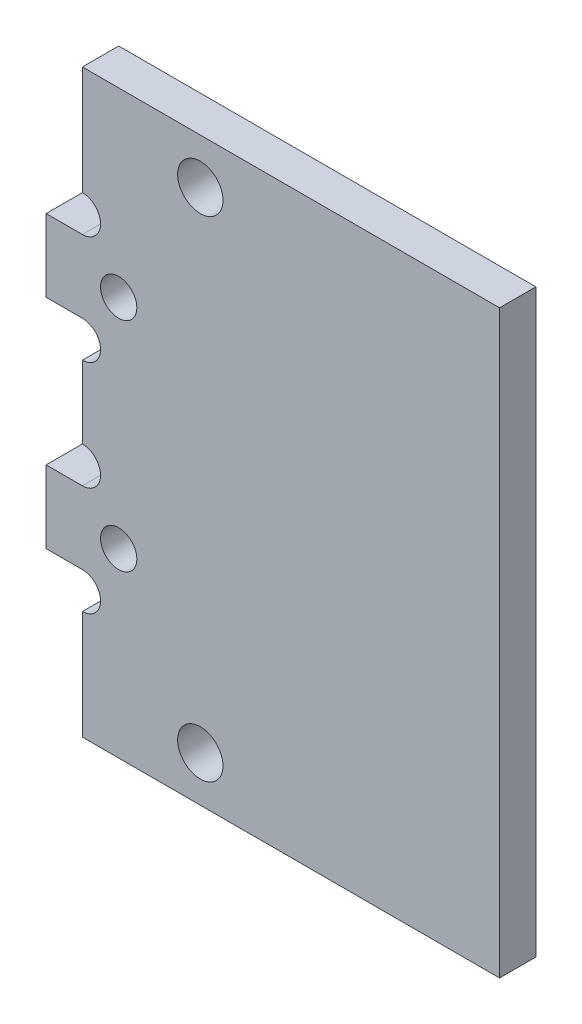
ISO-10303-21;
HEADER;
FILE_DESCRIPTION(('STEP AP214'),'2;1');
FILE_NAME('part.step','',(''),(''),'','','');
FILE_SCHEMA(('AUTOMOTIVE_DESIGN { 1 0 10303 214 1 1 1 1 }'));
ENDSEC;
DATA;
#1=APPLICATION_CONTEXT('core data for automotive mechanical design processes');
#2=APPLICATION_PROTOCOL_DEFINITION('international standard','automotive_design',2000,#1);
#3=PRODUCT_CONTEXT('',#1,'mechanical');
#4=PRODUCT('Part','Part','',(#3));
#5=PRODUCT_RELATED_PRODUCT_CATEGORY('part','',(#4));
#6=PRODUCT_DEFINITION_FORMATION('','',#4);
#7=PRODUCT_DEFINITION_CONTEXT('part definition',#1,'design');
#8=PRODUCT_DEFINITION('design','',#6,#7);
#9=PRODUCT_DEFINITION_SHAPE('','',#8);
#10=(LENGTH_UNIT() NAMED_UNIT(*) SI_UNIT(.MILLI.,.METRE.));
#11=(NAMED_UNIT(*) PLANE_ANGLE_UNIT() SI_UNIT($,.RADIAN.));
#12=(NAMED_UNIT(*) SI_UNIT($,.STERADIAN.) SOLID_ANGLE_UNIT());
#13=UNCERTAINTY_MEASURE_WITH_UNIT(LENGTH_MEASURE(1.E-05),#10,'distance_accuracy_value','');
#14=(GEOMETRIC_REPRESENTATION_CONTEXT(3) GLOBAL_UNCERTAINTY_ASSIGNED_CONTEXT((#13)) GLOBAL_UNIT_ASSIGNED_CONTEXT((#10,
#11,#12)) REPRESENTATION_CONTEXT('',''));
#15=CARTESIAN_POINT('',(0.,0.,0.));
#16=DIRECTION('',(0.,0.,1.));
#17=DIRECTION('',(1.,0.,0.));
#18=AXIS2_PLACEMENT_3D('',#15,#16,#17);
#19=CARTESIAN_POINT('',(-25.7162131979419,3.1625,2.));
#20=DIRECTION('',(0.,0.,1.));
#21=DIRECTION('',(1.,0.,0.));
#22=AXIS2_PLACEMENT_3D('',#19,#20,#21);
#23=PLANE('',#22);
#24=DIRECTION('',(0.,-1.,0.));
#25=VECTOR('',#24,1.);
#26=CARTESIAN_POINT('',(-2.71621319794187,3.1625,2.));
#27=LINE('',#26,#25);
#28=CARTESIAN_POINT('',(-2.71621319794187,10.1625,2.));
#29=VERTEX_POINT('',#28);
#30=CARTESIAN_POINT('',(-2.71621319794187,-21.8375,2.));
#31=VERTEX_POINT('',#30);
#32=EDGE_CURVE('E296',#29,#31,#27,.T.);
#33=ORIENTED_EDGE('',*,*,#32,.F.);
#34=DIRECTION('',(-1.,0.,0.));
#35=VECTOR('',#34,1.);
#36=CARTESIAN_POINT('',(-17.2162131979419,10.1625,2.));
#37=LINE('',#36,#35);
#38=CARTESIAN_POINT('',(-25.7162131979419,10.1625,2.));
#39=VERTEX_POINT('',#38);
#40=EDGE_CURVE('E114',#29,#39,#37,.T.);
#41=ORIENTED_EDGE('',*,*,#40,.T.);
#42=DIRECTION('',(0.,-1.,0.));
#43=VECTOR('',#42,1.);
#44=CARTESIAN_POINT('',(-25.7162131979419,10.1625,2.));
#45=LINE('',#44,#43);
#46=CARTESIAN_POINT('',(-25.7162131979419,4.1625,2.));
#47=VERTEX_POINT('',#46);
#48=EDGE_CURVE('E243',#39,#47,#45,.T.);
#49=ORIENTED_EDGE('',*,*,#48,.T.);
#50=CARTESIAN_POINT('',(-25.7162131979419,3.1625,2.));
#51=DIRECTION('',(0.,0.,-1.));
#52=DIRECTION('',(1.,0.,0.));
#53=AXIS2_PLACEMENT_3D('',#50,#51,#52);
#54=CIRCLE('',#53,1.);
#55=CARTESIAN_POINT('',(-25.7162131979419,2.1625,2.));
#56=VERTEX_POINT('',#55);
#57=EDGE_CURVE('E262',#47,#56,#54,.T.);
#58=ORIENTED_EDGE('',*,*,#57,.T.);
#59=DIRECTION('',(-1.,0.,0.));
#60=VECTOR('',#59,1.);
#61=CARTESIAN_POINT('',(-25.7162131979419,2.1625,2.));
#62=LINE('',#61,#60);
#63=CARTESIAN_POINT('',(-27.7162131979419,2.1625,2.));
#64=VERTEX_POINT('',#63);
#65=EDGE_CURVE('E259',#56,#64,#62,.T.);
#66=ORIENTED_EDGE('',*,*,#65,.T.);
#67=DIRECTION('',(0.,-1.,0.));
#68=VECTOR('',#67,1.);
#69=CARTESIAN_POINT('',(-27.7162131979419,2.1625,2.));
#70=LINE('',#69,#68);
#71=CARTESIAN_POINT('',(-27.7162131979419,-1.8375,2.));
#72=VERTEX_POINT('',#71);
#73=EDGE_CURVE('E261',#64,#72,#70,.T.);
#74=ORIENTED_EDGE('',*,*,#73,.T.);
#75=DIRECTION('',(1.,0.,0.));
#76=VECTOR('',#75,1.);
#77=CARTESIAN_POINT('',(-27.7162131979419,-1.8375,2.));
#78=LINE('',#77,#76);
#79=CARTESIAN_POINT('',(-25.7162131979419,-1.8375,2.));
#80=VERTEX_POINT('',#79);
#81=EDGE_CURVE('E264',#72,#80,#78,.T.);
#82=ORIENTED_EDGE('',*,*,#81,.T.);
#83=CARTESIAN_POINT('',(-25.7162131979419,-2.8375,2.));
#84=DIRECTION('',(0.,0.,-1.));
#85=DIRECTION('',(-1.,0.,0.));
#86=AXIS2_PLACEMENT_3D('',#83,#84,#85);
#87=CIRCLE('',#86,1.);
#88=CARTESIAN_POINT('',(-25.7162131979419,-3.8375,2.));
#89=VERTEX_POINT('',#88);
#90=EDGE_CURVE('E270',#80,#89,#87,.T.);
#91=ORIENTED_EDGE('',*,*,#90,.T.);
#92=DIRECTION('',(0.,-1.,0.));
#93=VECTOR('',#92,1.);
#94=CARTESIAN_POINT('',(-25.7162131979419,-3.8375,2.));
#95=LINE('',#94,#93);
#96=CARTESIAN_POINT('',(-25.7162131979419,-7.8375,2.));
#97=VERTEX_POINT('',#96);
#98=EDGE_CURVE('E272',#89,#97,#95,.T.);
#99=ORIENTED_EDGE('',*,*,#98,.T.);
#100=CARTESIAN_POINT('',(-25.7162131979419,-8.8375,2.));
#101=DIRECTION('',(0.,0.,-1.));
#102=DIRECTION('',(1.,0.,0.));
#103=AXIS2_PLACEMENT_3D('',#100,#101,#102);
#104=CIRCLE('',#103,1.);
#105=CARTESIAN_POINT('',(-25.7162131979419,-9.8375,2.));
#106=VERTEX_POINT('',#105);
#107=EDGE_CURVE('E274',#97,#106,#104,.T.);
#108=ORIENTED_EDGE('',*,*,#107,.T.);
#109=DIRECTION('',(-1.,0.,0.));
#110=VECTOR('',#109,1.);
#111=CARTESIAN_POINT('',(-25.7162131979419,-9.8375,2.));
#112=LINE('',#111,#110);
#113=CARTESIAN_POINT('',(-27.7162131979419,-9.8375,2.));
#114=VERTEX_POINT('',#113);
#115=EDGE_CURVE('E276',#106,#114,#112,.T.);
#116=ORIENTED_EDGE('',*,*,#115,.T.);
#117=DIRECTION('',(0.,-1.,0.));
#118=VECTOR('',#117,1.);
#119=CARTESIAN_POINT('',(-27.7162131979419,-9.8375,2.));
#120=LINE('',#119,#118);
#121=CARTESIAN_POINT('',(-27.7162131979419,-13.8375,2.));
#122=VERTEX_POINT('',#121);
#123=EDGE_CURVE('E155',#114,#122,#120,.T.);
#124=ORIENTED_EDGE('',*,*,#123,.T.);
#125=DIRECTION('',(1.,0.,0.));
#126=VECTOR('',#125,1.);
#127=CARTESIAN_POINT('',(-27.7162131979419,-13.8375,2.));
#128=LINE('',#127,#126);
#129=CARTESIAN_POINT('',(-25.7162131979419,-13.8375,2.));
#130=VERTEX_POINT('',#129);
#131=EDGE_CURVE('E148',#122,#130,#128,.T.);
#132=ORIENTED_EDGE('',*,*,#131,.T.);
#133=CARTESIAN_POINT('',(-25.7162131979419,-14.8375,2.));
#134=DIRECTION('',(0.,0.,-1.));
#135=DIRECTION('',(-1.,0.,0.));
#136=AXIS2_PLACEMENT_3D('',#133,#134,#135);
#137=CIRCLE('',#136,0.999999999999999);
#138=CARTESIAN_POINT('',(-25.7162131979419,-15.8375,2.));
#139=VERTEX_POINT('',#138);
#140=EDGE_CURVE('E152',#130,#139,#137,.T.);
#141=ORIENTED_EDGE('',*,*,#140,.T.);
#142=DIRECTION('',(0.,-1.,0.));
#143=VECTOR('',#142,1.);
#144=CARTESIAN_POINT('',(-25.7162131979419,-15.8375,2.));
#145=LINE('',#144,#143);
#146=CARTESIAN_POINT('',(-25.7162131979419,-21.8375,2.));
#147=VERTEX_POINT('',#146);
#148=EDGE_CURVE('E55',#139,#147,#145,.T.);
#149=ORIENTED_EDGE('',*,*,#148,.T.);
#150=DIRECTION('',(1.,0.,0.));
#151=VECTOR('',#150,1.);
#152=CARTESIAN_POINT('',(-19.7162131979419,-21.8375,2.));
#153=LINE('',#152,#151);
#154=EDGE_CURVE('E173',#147,#31,#153,.T.);
#155=ORIENTED_EDGE('',*,*,#154,.T.);
#156=EDGE_LOOP('',(#33,#41,#49,#58,#66,#74,#82,#91,#99,#108,#116,#124,#132,#141,#149,#155));
#157=FACE_BOUND('',#156,.T.);
#158=CARTESIAN_POINT('',(-23.7162131979419,-11.8375,2.));
#159=DIRECTION('',(0.,0.,1.));
#160=DIRECTION('',(1.,0.,0.));
#161=AXIS2_PLACEMENT_3D('',#158,#159,#160);
#162=CIRCLE('',#161,1.);
#163=CARTESIAN_POINT('',(-22.7162131979419,-11.8375,2.));
#164=VERTEX_POINT('',#163);
#165=EDGE_CURVE('E311',#164,#164,#162,.T.);
#166=ORIENTED_EDGE('',*,*,#165,.F.);
#167=EDGE_LOOP('',(#166));
#168=FACE_BOUND('',#167,.T.);
#169=CARTESIAN_POINT('',(-19.2162131979419,7.66249999999999,2.));
#170=DIRECTION('',(0.,0.,1.));
#171=DIRECTION('',(1.,0.,0.));
#172=AXIS2_PLACEMENT_3D('',#169,#170,#171);
#173=CIRCLE('',#172,1.25);
#174=CARTESIAN_POINT('',(-17.9662131979419,7.66249999999999,2.));
#175=VERTEX_POINT('',#174);
#176=EDGE_CURVE('E182',#175,#175,#173,.T.);
#177=ORIENTED_EDGE('',*,*,#176,.F.);
#178=EDGE_LOOP('',(#177));
#179=FACE_BOUND('',#178,.T.);
#180=CARTESIAN_POINT('',(-19.2162131979419,-19.3375,2.));
#181=DIRECTION('',(0.,0.,1.));
#182=DIRECTION('',(1.,0.,0.));
#183=AXIS2_PLACEMENT_3D('',#180,#181,#182);
#184=CIRCLE('',#183,1.25);
#185=CARTESIAN_POINT('',(-17.9662131979419,-19.3375,2.));
#186=VERTEX_POINT('',#185);
#187=EDGE_CURVE('E317',#186,#186,#184,.T.);
#188=ORIENTED_EDGE('',*,*,#187,.F.);
#189=EDGE_LOOP('',(#188));
#190=FACE_BOUND('',#189,.T.);
#191=CARTESIAN_POINT('',(-23.7162131979419,0.162500000000001,2.));
#192=DIRECTION('',(0.,0.,1.));
#193=DIRECTION('',(1.,0.,0.));
#194=AXIS2_PLACEMENT_3D('',#191,#192,#193);
#195=CIRCLE('',#194,1.);
#196=CARTESIAN_POINT('',(-22.7162131979419,0.162500000000001,2.));
#197=VERTEX_POINT('',#196);
#198=EDGE_CURVE('E305',#197,#197,#195,.T.);
#199=ORIENTED_EDGE('',*,*,#198,.F.);
#200=EDGE_LOOP('',(#199));
#201=FACE_BOUND('',#200,.T.);
#202=ADVANCED_FACE('F32',(#157,#168,#179,#190,#201),#23,.T.);
#203=CARTESIAN_POINT('',(-25.7162131979419,3.1625,0.));
#204=DIRECTION('',(0.,0.,1.));
#205=DIRECTION('',(1.,0.,0.));
#206=AXIS2_PLACEMENT_3D('',#203,#204,#205);
#207=PLANE('',#206);
#208=DIRECTION('',(-1.,0.,0.));
#209=VECTOR('',#208,1.);
#210=CARTESIAN_POINT('',(-17.2162131979419,10.1625,0.));
#211=LINE('',#210,#209);
#212=CARTESIAN_POINT('',(-2.71621319794187,10.1625,0.));
#213=VERTEX_POINT('',#212);
#214=CARTESIAN_POINT('',(-25.7162131979419,10.1625,0.));
#215=VERTEX_POINT('',#214);
#216=EDGE_CURVE('E206',#213,#215,#211,.T.);
#217=ORIENTED_EDGE('',*,*,#216,.F.);
#218=DIRECTION('',(0.,1.,0.));
#219=VECTOR('',#218,1.);
#220=CARTESIAN_POINT('',(-2.71621319794187,10.1625,0.));
#221=LINE('',#220,#219);
#222=CARTESIAN_POINT('',(-2.71621319794187,-21.8375,0.));
#223=VERTEX_POINT('',#222);
#224=EDGE_CURVE('E47',#223,#213,#221,.T.);
#225=ORIENTED_EDGE('',*,*,#224,.F.);
#226=DIRECTION('',(1.,0.,0.));
#227=VECTOR('',#226,1.);
#228=CARTESIAN_POINT('',(13.2837868020581,-21.8375,0.));
#229=LINE('',#228,#227);
#230=CARTESIAN_POINT('',(-25.7162131979419,-21.8375,0.));
#231=VERTEX_POINT('',#230);
#232=EDGE_CURVE('E106',#231,#223,#229,.T.);
#233=ORIENTED_EDGE('',*,*,#232,.F.);
#234=DIRECTION('',(0.,-1.,0.));
#235=VECTOR('',#234,1.);
#236=CARTESIAN_POINT('',(-25.7162131979419,-15.8375,0.));
#237=LINE('',#236,#235);
#238=CARTESIAN_POINT('',(-25.7162131979419,-15.8375,0.));
#239=VERTEX_POINT('',#238);
#240=EDGE_CURVE('E203',#239,#231,#237,.T.);
#241=ORIENTED_EDGE('',*,*,#240,.F.);
#242=CARTESIAN_POINT('',(-25.7162131979419,-14.8375,0.));
#243=DIRECTION('',(0.,0.,-1.));
#244=DIRECTION('',(-1.,0.,0.));
#245=AXIS2_PLACEMENT_3D('',#242,#243,#244);
#246=CIRCLE('',#245,0.999999999999999);
#247=CARTESIAN_POINT('',(-25.7162131979419,-13.8375,0.));
#248=VERTEX_POINT('',#247);
#249=EDGE_CURVE('E201',#248,#239,#246,.T.);
#250=ORIENTED_EDGE('',*,*,#249,.F.);
#251=DIRECTION('',(1.,0.,0.));
#252=VECTOR('',#251,1.);
#253=CARTESIAN_POINT('',(-27.7162131979419,-13.8375,0.));
#254=LINE('',#253,#252);
#255=CARTESIAN_POINT('',(-27.7162131979419,-13.8375,0.));
#256=VERTEX_POINT('',#255);
#257=EDGE_CURVE('E164',#256,#248,#254,.T.);
#258=ORIENTED_EDGE('',*,*,#257,.F.);
#259=DIRECTION('',(0.,-1.,0.));
#260=VECTOR('',#259,1.);
#261=CARTESIAN_POINT('',(-27.7162131979419,-9.8375,0.));
#262=LINE('',#261,#260);
#263=CARTESIAN_POINT('',(-27.7162131979419,-9.8375,0.));
#264=VERTEX_POINT('',#263);
#265=EDGE_CURVE('E198',#264,#256,#262,.T.);
#266=ORIENTED_EDGE('',*,*,#265,.F.);
#267=DIRECTION('',(-1.,0.,0.));
#268=VECTOR('',#267,1.);
#269=CARTESIAN_POINT('',(-25.7162131979419,-9.8375,0.));
#270=LINE('',#269,#268);
#271=CARTESIAN_POINT('',(-25.7162131979419,-9.8375,0.));
#272=VERTEX_POINT('',#271);
#273=EDGE_CURVE('E196',#272,#264,#270,.T.);
#274=ORIENTED_EDGE('',*,*,#273,.F.);
#275=CARTESIAN_POINT('',(-25.7162131979419,-8.8375,0.));
#276=DIRECTION('',(0.,0.,-1.));
#277=DIRECTION('',(1.,0.,0.));
#278=AXIS2_PLACEMENT_3D('',#275,#276,#277);
#279=CIRCLE('',#278,1.);
#280=CARTESIAN_POINT('',(-25.7162131979419,-7.8375,0.));
#281=VERTEX_POINT('',#280);
#282=EDGE_CURVE('E194',#281,#272,#279,.T.);
#283=ORIENTED_EDGE('',*,*,#282,.F.);
#284=DIRECTION('',(0.,-1.,0.));
#285=VECTOR('',#284,1.);
#286=CARTESIAN_POINT('',(-25.7162131979419,-3.8375,0.));
#287=LINE('',#286,#285);
#288=CARTESIAN_POINT('',(-25.7162131979419,-3.8375,0.));
#289=VERTEX_POINT('',#288);
#290=EDGE_CURVE('E192',#289,#281,#287,.T.);
#291=ORIENTED_EDGE('',*,*,#290,.F.);
#292=CARTESIAN_POINT('',(-25.7162131979419,-2.8375,0.));
#293=DIRECTION('',(0.,0.,-1.));
#294=DIRECTION('',(-1.,0.,0.));
#295=AXIS2_PLACEMENT_3D('',#292,#293,#294);
#296=CIRCLE('',#295,1.);
#297=CARTESIAN_POINT('',(-25.7162131979419,-1.8375,0.));
#298=VERTEX_POINT('',#297);
#299=EDGE_CURVE('E190',#298,#289,#296,.T.);
#300=ORIENTED_EDGE('',*,*,#299,.F.);
#301=DIRECTION('',(1.,0.,0.));
#302=VECTOR('',#301,1.);
#303=CARTESIAN_POINT('',(-27.7162131979419,-1.8375,0.));
#304=LINE('',#303,#302);
#305=CARTESIAN_POINT('',(-27.7162131979419,-1.8375,0.));
#306=VERTEX_POINT('',#305);
#307=EDGE_CURVE('E188',#306,#298,#304,.T.);
#308=ORIENTED_EDGE('',*,*,#307,.F.);
#309=DIRECTION('',(0.,-1.,0.));
#310=VECTOR('',#309,1.);
#311=CARTESIAN_POINT('',(-27.7162131979419,2.1625,0.));
#312=LINE('',#311,#310);
#313=CARTESIAN_POINT('',(-27.7162131979419,2.1625,0.));
#314=VERTEX_POINT('',#313);
#315=EDGE_CURVE('E186',#314,#306,#312,.T.);
#316=ORIENTED_EDGE('',*,*,#315,.F.);
#317=DIRECTION('',(-1.,0.,0.));
#318=VECTOR('',#317,1.);
#319=CARTESIAN_POINT('',(-25.7162131979419,2.1625,0.));
#320=LINE('',#319,#318);
#321=CARTESIAN_POINT('',(-25.7162131979419,2.1625,0.));
#322=VERTEX_POINT('',#321);
#323=EDGE_CURVE('E184',#322,#314,#320,.T.);
#324=ORIENTED_EDGE('',*,*,#323,.F.);
#325=CARTESIAN_POINT('',(-25.7162131979419,3.1625,0.));
#326=DIRECTION('',(0.,0.,-1.));
#327=DIRECTION('',(1.,0.,0.));
#328=AXIS2_PLACEMENT_3D('',#325,#326,#327);
#329=CIRCLE('',#328,1.);
#330=CARTESIAN_POINT('',(-25.7162131979419,4.1625,0.));
#331=VERTEX_POINT('',#330);
#332=EDGE_CURVE('E181',#331,#322,#329,.T.);
#333=ORIENTED_EDGE('',*,*,#332,.F.);
#334=DIRECTION('',(0.,-1.,0.));
#335=VECTOR('',#334,1.);
#336=CARTESIAN_POINT('',(-25.7162131979419,10.1625,0.));
#337=LINE('',#336,#335);
#338=EDGE_CURVE('E179',#215,#331,#337,.T.);
#339=ORIENTED_EDGE('',*,*,#338,.F.);
#340=EDGE_LOOP('',(#217,#225,#233,#241,#250,#258,#266,#274,#283,#291,#300,#308,#316,#324,#333,#339));
#341=FACE_BOUND('',#340,.T.);
#342=CARTESIAN_POINT('',(-19.2162131979419,7.66249999999999,0.));
#343=DIRECTION('',(0.,0.,1.));
#344=DIRECTION('',(1.,0.,0.));
#345=AXIS2_PLACEMENT_3D('',#342,#343,#344);
#346=CIRCLE('',#345,1.25);
#347=CARTESIAN_POINT('',(-17.9662131979419,7.66249999999999,0.));
#348=VERTEX_POINT('',#347);
#349=EDGE_CURVE('E320',#348,#348,#346,.T.);
#350=ORIENTED_EDGE('',*,*,#349,.T.);
#351=EDGE_LOOP('',(#350));
#352=FACE_BOUND('',#351,.T.);
#353=CARTESIAN_POINT('',(-19.2162131979419,-19.3375,0.));
#354=DIRECTION('',(0.,0.,1.));
#355=DIRECTION('',(1.,0.,0.));
#356=AXIS2_PLACEMENT_3D('',#353,#354,#355);
#357=CIRCLE('',#356,1.25);
#358=CARTESIAN_POINT('',(-17.9662131979419,-19.3375,0.));
#359=VERTEX_POINT('',#358);
#360=EDGE_CURVE('E314',#359,#359,#357,.T.);
#361=ORIENTED_EDGE('',*,*,#360,.T.);
#362=EDGE_LOOP('',(#361));
#363=FACE_BOUND('',#362,.T.);
#364=CARTESIAN_POINT('',(-23.7162131979419,-11.8375,0.));
#365=DIRECTION('',(0.,0.,1.));
#366=DIRECTION('',(1.,0.,0.));
#367=AXIS2_PLACEMENT_3D('',#364,#365,#366);
#368=CIRCLE('',#367,1.);
#369=CARTESIAN_POINT('',(-22.7162131979419,-11.8375,0.));
#370=VERTEX_POINT('',#369);
#371=EDGE_CURVE('E308',#370,#370,#368,.T.);
#372=ORIENTED_EDGE('',*,*,#371,.T.);
#373=EDGE_LOOP('',(#372));
#374=FACE_BOUND('',#373,.T.);
#375=CARTESIAN_POINT('',(-23.7162131979419,0.162500000000001,0.));
#376=DIRECTION('',(0.,0.,1.));
#377=DIRECTION('',(1.,0.,0.));
#378=AXIS2_PLACEMENT_3D('',#375,#376,#377);
#379=CIRCLE('',#378,1.);
#380=CARTESIAN_POINT('',(-22.7162131979419,0.162500000000001,0.));
#381=VERTEX_POINT('',#380);
#382=EDGE_CURVE('E304',#381,#381,#379,.T.);
#383=ORIENTED_EDGE('',*,*,#382,.T.);
#384=EDGE_LOOP('',(#383));
#385=FACE_BOUND('',#384,.T.);
#386=ADVANCED_FACE('F247',(#341,#352,#363,#374,#385),#207,.F.);
#387=CARTESIAN_POINT('',(-25.7162131979419,10.1625,2.));
#388=DIRECTION('',(1.,0.,0.));
#389=DIRECTION('',(0.,1.,0.));
#390=AXIS2_PLACEMENT_3D('',#387,#388,#389);
#391=PLANE('',#390);
#392=ORIENTED_EDGE('',*,*,#338,.T.);
#393=DIRECTION('',(0.,0.,-1.));
#394=VECTOR('',#393,1.);
#395=CARTESIAN_POINT('',(-25.7162131979419,4.1625,2.));
#396=LINE('',#395,#394);
#397=EDGE_CURVE('E236',#47,#331,#396,.T.);
#398=ORIENTED_EDGE('',*,*,#397,.F.);
#399=ORIENTED_EDGE('',*,*,#48,.F.);
#400=DIRECTION('',(0.,0.,-1.));
#401=VECTOR('',#400,1.);
#402=CARTESIAN_POINT('',(-25.7162131979419,10.1625,2.));
#403=LINE('',#402,#401);
#404=EDGE_CURVE('E40',#39,#215,#403,.T.);
#405=ORIENTED_EDGE('',*,*,#404,.T.);
#406=EDGE_LOOP('',(#392,#398,#399,#405));
#407=FACE_BOUND('',#406,.T.);
#408=ADVANCED_FACE('F34',(#407),#391,.F.);
#409=CARTESIAN_POINT('',(-25.7162131979419,3.1625,2.));
#410=DIRECTION('',(0.,0.,-1.));
#411=DIRECTION('',(-1.,0.,0.));
#412=AXIS2_PLACEMENT_3D('',#409,#410,#411);
#413=CYLINDRICAL_SURFACE('',#412,1.);
#414=ORIENTED_EDGE('',*,*,#332,.T.);
#415=DIRECTION('',(0.,0.,-1.));
#416=VECTOR('',#415,1.);
#417=CARTESIAN_POINT('',(-25.7162131979419,2.1625,2.));
#418=LINE('',#417,#416);
#419=EDGE_CURVE('E233',#56,#322,#418,.T.);
#420=ORIENTED_EDGE('',*,*,#419,.F.);
#421=ORIENTED_EDGE('',*,*,#57,.F.);
#422=ORIENTED_EDGE('',*,*,#397,.T.);
#423=EDGE_LOOP('',(#414,#420,#421,#422));
#424=FACE_BOUND('',#423,.T.);
#425=ADVANCED_FACE('F253',(#424),#413,.F.);
#426=CARTESIAN_POINT('',(-25.7162131979419,2.1625,2.));
#427=DIRECTION('',(0.,-1.,0.));
#428=DIRECTION('',(1.,0.,0.));
#429=AXIS2_PLACEMENT_3D('',#426,#427,#428);
#430=PLANE('',#429);
#431=ORIENTED_EDGE('',*,*,#323,.T.);
#432=DIRECTION('',(0.,0.,-1.));
#433=VECTOR('',#432,1.);
#434=CARTESIAN_POINT('',(-27.7162131979419,2.1625,2.));
#435=LINE('',#434,#433);
#436=EDGE_CURVE('E230',#64,#314,#435,.T.);
#437=ORIENTED_EDGE('',*,*,#436,.F.);
#438=ORIENTED_EDGE('',*,*,#65,.F.);
#439=ORIENTED_EDGE('',*,*,#419,.T.);
#440=EDGE_LOOP('',(#431,#437,#438,#439));
#441=FACE_BOUND('',#440,.T.);
#442=ADVANCED_FACE('F257',(#441),#430,.F.);
#443=CARTESIAN_POINT('',(-27.7162131979419,2.1625,2.));
#444=DIRECTION('',(1.,0.,0.));
#445=DIRECTION('',(0.,0.,-1.));
#446=AXIS2_PLACEMENT_3D('',#443,#444,#445);
#447=PLANE('',#446);
#448=ORIENTED_EDGE('',*,*,#315,.T.);
#449=DIRECTION('',(0.,0.,-1.));
#450=VECTOR('',#449,1.);
#451=CARTESIAN_POINT('',(-27.7162131979419,-1.8375,2.));
#452=LINE('',#451,#450);
#453=EDGE_CURVE('E227',#72,#306,#452,.T.);
#454=ORIENTED_EDGE('',*,*,#453,.F.);
#455=ORIENTED_EDGE('',*,*,#73,.F.);
#456=ORIENTED_EDGE('',*,*,#436,.T.);
#457=EDGE_LOOP('',(#448,#454,#455,#456));
#458=FACE_BOUND('',#457,.T.);
#459=ADVANCED_FACE('F378',(#458),#447,.F.);
#460=CARTESIAN_POINT('',(-27.7162131979419,-1.8375,2.));
#461=DIRECTION('',(0.,1.,0.));
#462=DIRECTION('',(0.,0.,1.));
#463=AXIS2_PLACEMENT_3D('',#460,#461,#462);
#464=PLANE('',#463);
#465=ORIENTED_EDGE('',*,*,#307,.T.);
#466=DIRECTION('',(0.,0.,-1.));
#467=VECTOR('',#466,1.);
#468=CARTESIAN_POINT('',(-25.7162131979419,-1.8375,2.));
#469=LINE('',#468,#467);
#470=EDGE_CURVE('E224',#80,#298,#469,.T.);
#471=ORIENTED_EDGE('',*,*,#470,.F.);
#472=ORIENTED_EDGE('',*,*,#81,.F.);
#473=ORIENTED_EDGE('',*,*,#453,.T.);
#474=EDGE_LOOP('',(#465,#471,#472,#473));
#475=FACE_BOUND('',#474,.T.);
#476=ADVANCED_FACE('F374',(#475),#464,.F.);
#477=CARTESIAN_POINT('',(-25.7162131979419,-2.8375,2.));
#478=DIRECTION('',(0.,0.,-1.));
#479=DIRECTION('',(-1.,0.,0.));
#480=AXIS2_PLACEMENT_3D('',#477,#478,#479);
#481=CYLINDRICAL_SURFACE('',#480,1.);
#482=ORIENTED_EDGE('',*,*,#299,.T.);
#483=DIRECTION('',(0.,0.,-1.));
#484=VECTOR('',#483,1.);
#485=CARTESIAN_POINT('',(-25.7162131979419,-3.8375,2.));
#486=LINE('',#485,#484);
#487=EDGE_CURVE('E221',#89,#289,#486,.T.);
#488=ORIENTED_EDGE('',*,*,#487,.F.);
#489=ORIENTED_EDGE('',*,*,#90,.F.);
#490=ORIENTED_EDGE('',*,*,#470,.T.);
#491=EDGE_LOOP('',(#482,#488,#489,#490));
#492=FACE_BOUND('',#491,.T.);
#493=ADVANCED_FACE('F370',(#492),#481,.F.);
#494=CARTESIAN_POINT('',(-25.7162131979419,-3.8375,2.));
#495=DIRECTION('',(1.,0.,0.));
#496=DIRECTION('',(0.,0.,-1.));
#497=AXIS2_PLACEMENT_3D('',#494,#495,#496);
#498=PLANE('',#497);
#499=ORIENTED_EDGE('',*,*,#290,.T.);
#500=DIRECTION('',(0.,0.,-1.));
#501=VECTOR('',#500,1.);
#502=CARTESIAN_POINT('',(-25.7162131979419,-7.8375,2.));
#503=LINE('',#502,#501);
#504=EDGE_CURVE('E218',#97,#281,#503,.T.);
#505=ORIENTED_EDGE('',*,*,#504,.F.);
#506=ORIENTED_EDGE('',*,*,#98,.F.);
#507=ORIENTED_EDGE('',*,*,#487,.T.);
#508=EDGE_LOOP('',(#499,#505,#506,#507));
#509=FACE_BOUND('',#508,.T.);
#510=ADVANCED_FACE('F366',(#509),#498,.F.);
#511=CARTESIAN_POINT('',(-25.7162131979419,-8.8375,2.));
#512=DIRECTION('',(0.,0.,-1.));
#513=DIRECTION('',(-1.,0.,0.));
#514=AXIS2_PLACEMENT_3D('',#511,#512,#513);
#515=CYLINDRICAL_SURFACE('',#514,1.);
#516=ORIENTED_EDGE('',*,*,#282,.T.);
#517=DIRECTION('',(0.,0.,-1.));
#518=VECTOR('',#517,1.);
#519=CARTESIAN_POINT('',(-25.7162131979419,-9.8375,2.));
#520=LINE('',#519,#518);
#521=EDGE_CURVE('E215',#106,#272,#520,.T.);
#522=ORIENTED_EDGE('',*,*,#521,.F.);
#523=ORIENTED_EDGE('',*,*,#107,.F.);
#524=ORIENTED_EDGE('',*,*,#504,.T.);
#525=EDGE_LOOP('',(#516,#522,#523,#524));
#526=FACE_BOUND('',#525,.T.);
#527=ADVANCED_FACE('F363',(#526),#515,.F.);
#528=CARTESIAN_POINT('',(-25.7162131979419,-9.8375,2.));
#529=DIRECTION('',(0.,-1.,0.));
#530=DIRECTION('',(0.,0.,-1.));
#531=AXIS2_PLACEMENT_3D('',#528,#529,#530);
#532=PLANE('',#531);
#533=ORIENTED_EDGE('',*,*,#273,.T.);
#534=DIRECTION('',(0.,0.,-1.));
#535=VECTOR('',#534,1.);
#536=CARTESIAN_POINT('',(-27.7162131979419,-9.8375,2.));
#537=LINE('',#536,#535);
#538=EDGE_CURVE('E212',#114,#264,#537,.T.);
#539=ORIENTED_EDGE('',*,*,#538,.F.);
#540=ORIENTED_EDGE('',*,*,#115,.F.);
#541=ORIENTED_EDGE('',*,*,#521,.T.);
#542=EDGE_LOOP('',(#533,#539,#540,#541));
#543=FACE_BOUND('',#542,.T.);
#544=ADVANCED_FACE('F282',(#543),#532,.F.);
#545=CARTESIAN_POINT('',(-27.7162131979419,-9.8375,2.));
#546=DIRECTION('',(1.,0.,0.));
#547=DIRECTION('',(0.,0.,-1.));
#548=AXIS2_PLACEMENT_3D('',#545,#546,#547);
#549=PLANE('',#548);
#550=ORIENTED_EDGE('',*,*,#265,.T.);
#551=DIRECTION('',(0.,0.,-1.));
#552=VECTOR('',#551,1.);
#553=CARTESIAN_POINT('',(-27.7162131979419,-13.8375,2.));
#554=LINE('',#553,#552);
#555=EDGE_CURVE('E167',#122,#256,#554,.T.);
#556=ORIENTED_EDGE('',*,*,#555,.F.);
#557=ORIENTED_EDGE('',*,*,#123,.F.);
#558=ORIENTED_EDGE('',*,*,#538,.T.);
#559=EDGE_LOOP('',(#550,#556,#557,#558));
#560=FACE_BOUND('',#559,.T.);
#561=ADVANCED_FACE('F286',(#560),#549,.F.);
#562=CARTESIAN_POINT('',(-27.7162131979419,-13.8375,2.));
#563=DIRECTION('',(0.,1.,0.));
#564=DIRECTION('',(0.,0.,1.));
#565=AXIS2_PLACEMENT_3D('',#562,#563,#564);
#566=PLANE('',#565);
#567=ORIENTED_EDGE('',*,*,#257,.T.);
#568=DIRECTION('',(0.,0.,-1.));
#569=VECTOR('',#568,1.);
#570=CARTESIAN_POINT('',(-25.7162131979419,-13.8375,2.));
#571=LINE('',#570,#569);
#572=EDGE_CURVE('E161',#130,#248,#571,.T.);
#573=ORIENTED_EDGE('',*,*,#572,.F.);
#574=ORIENTED_EDGE('',*,*,#131,.F.);
#575=ORIENTED_EDGE('',*,*,#555,.T.);
#576=EDGE_LOOP('',(#567,#573,#574,#575));
#577=FACE_BOUND('',#576,.T.);
#578=ADVANCED_FACE('F162',(#577),#566,.F.);
#579=CARTESIAN_POINT('',(-25.7162131979419,-14.8375,2.));
#580=DIRECTION('',(0.,0.,-1.));
#581=DIRECTION('',(-1.,0.,0.));
#582=AXIS2_PLACEMENT_3D('',#579,#580,#581);
#583=CYLINDRICAL_SURFACE('',#582,0.999999999999999);
#584=ORIENTED_EDGE('',*,*,#249,.T.);
#585=DIRECTION('',(0.,0.,-1.));
#586=VECTOR('',#585,1.);
#587=CARTESIAN_POINT('',(-25.7162131979419,-15.8375,2.));
#588=LINE('',#587,#586);
#589=EDGE_CURVE('E168',#139,#239,#588,.T.);
#590=ORIENTED_EDGE('',*,*,#589,.F.);
#591=ORIENTED_EDGE('',*,*,#140,.F.);
#592=ORIENTED_EDGE('',*,*,#572,.T.);
#593=EDGE_LOOP('',(#584,#590,#591,#592));
#594=FACE_BOUND('',#593,.T.);
#595=ADVANCED_FACE('F170',(#594),#583,.F.);
#596=CARTESIAN_POINT('',(-25.7162131979419,-15.8375,2.));
#597=DIRECTION('',(1.,0.,0.));
#598=DIRECTION('',(0.,0.,-1.));
#599=AXIS2_PLACEMENT_3D('',#596,#597,#598);
#600=PLANE('',#599);
#601=ORIENTED_EDGE('',*,*,#240,.T.);
#602=DIRECTION('',(0.,0.,-1.));
#603=VECTOR('',#602,1.);
#604=CARTESIAN_POINT('',(-25.7162131979419,-21.8375,2.));
#605=LINE('',#604,#603);
#606=EDGE_CURVE('E178',#147,#231,#605,.T.);
#607=ORIENTED_EDGE('',*,*,#606,.F.);
#608=ORIENTED_EDGE('',*,*,#148,.F.);
#609=ORIENTED_EDGE('',*,*,#589,.T.);
#610=EDGE_LOOP('',(#601,#607,#608,#609));
#611=FACE_BOUND('',#610,.T.);
#612=ADVANCED_FACE('F288',(#611),#600,.F.);
#613=CARTESIAN_POINT('',(13.2837868020581,-21.8375,2.));
#614=DIRECTION('',(0.,1.,0.));
#615=DIRECTION('',(-1.,0.,0.));
#616=AXIS2_PLACEMENT_3D('',#613,#614,#615);
#617=PLANE('',#616);
#618=ORIENTED_EDGE('',*,*,#232,.T.);
#619=DIRECTION('',(0.,0.,-1.));
#620=VECTOR('',#619,1.);
#621=CARTESIAN_POINT('',(-2.71621319794187,-21.8375,10.));
#622=LINE('',#621,#620);
#623=EDGE_CURVE('E294',#31,#223,#622,.T.);
#624=ORIENTED_EDGE('',*,*,#623,.F.);
#625=ORIENTED_EDGE('',*,*,#154,.F.);
#626=ORIENTED_EDGE('',*,*,#606,.T.);
#627=EDGE_LOOP('',(#618,#624,#625,#626));
#628=FACE_BOUND('',#627,.T.);
#629=ADVANCED_FACE('F292',(#628),#617,.F.);
#630=CARTESIAN_POINT('',(-17.2162131979419,10.1625,2.));
#631=DIRECTION('',(0.,-1.,0.));
#632=DIRECTION('',(0.,0.,-1.));
#633=AXIS2_PLACEMENT_3D('',#630,#631,#632);
#634=PLANE('',#633);
#635=ORIENTED_EDGE('',*,*,#40,.F.);
#636=DIRECTION('',(0.,0.,-1.));
#637=VECTOR('',#636,1.);
#638=CARTESIAN_POINT('',(-2.71621319794187,10.1625,2.));
#639=LINE('',#638,#637);
#640=EDGE_CURVE('E11',#29,#213,#639,.T.);
#641=ORIENTED_EDGE('',*,*,#640,.T.);
#642=ORIENTED_EDGE('',*,*,#216,.T.);
#643=ORIENTED_EDGE('',*,*,#404,.F.);
#644=EDGE_LOOP('',(#635,#641,#642,#643));
#645=FACE_BOUND('',#644,.T.);
#646=ADVANCED_FACE('F333',(#645),#634,.F.);
#647=CARTESIAN_POINT('',(-19.2162131979419,7.66249999999999,2.));
#648=DIRECTION('',(0.,0.,-1.));
#649=DIRECTION('',(-1.,0.,0.));
#650=AXIS2_PLACEMENT_3D('',#647,#648,#649);
#651=CYLINDRICAL_SURFACE('',#650,1.25);
#652=ORIENTED_EDGE('',*,*,#176,.T.);
#653=EDGE_LOOP('',(#652));
#654=FACE_BOUND('',#653,.T.);
#655=ORIENTED_EDGE('',*,*,#349,.F.);
#656=EDGE_LOOP('',(#655));
#657=FACE_BOUND('',#656,.T.);
#658=ADVANCED_FACE('F330',(#654,#657),#651,.F.);
#659=CARTESIAN_POINT('',(-19.2162131979419,-19.3375,2.));
#660=DIRECTION('',(0.,0.,-1.));
#661=DIRECTION('',(-1.,0.,0.));
#662=AXIS2_PLACEMENT_3D('',#659,#660,#661);
#663=CYLINDRICAL_SURFACE('',#662,1.25);
#664=ORIENTED_EDGE('',*,*,#187,.T.);
#665=EDGE_LOOP('',(#664));
#666=FACE_BOUND('',#665,.T.);
#667=ORIENTED_EDGE('',*,*,#360,.F.);
#668=EDGE_LOOP('',(#667));
#669=FACE_BOUND('',#668,.T.);
#670=ADVANCED_FACE('F332',(#666,#669),#663,.F.);
#671=CARTESIAN_POINT('',(-23.7162131979419,-11.8375,2.));
#672=DIRECTION('',(0.,0.,-1.));
#673=DIRECTION('',(-1.,0.,0.));
#674=AXIS2_PLACEMENT_3D('',#671,#672,#673);
#675=CYLINDRICAL_SURFACE('',#674,1.);
#676=ORIENTED_EDGE('',*,*,#165,.T.);
#677=EDGE_LOOP('',(#676));
#678=FACE_BOUND('',#677,.T.);
#679=ORIENTED_EDGE('',*,*,#371,.F.);
#680=EDGE_LOOP('',(#679));
#681=FACE_BOUND('',#680,.T.);
#682=ADVANCED_FACE('F340',(#678,#681),#675,.F.);
#683=CARTESIAN_POINT('',(-23.7162131979419,0.162500000000001,2.));
#684=DIRECTION('',(0.,0.,-1.));
#685=DIRECTION('',(-1.,0.,0.));
#686=AXIS2_PLACEMENT_3D('',#683,#684,#685);
#687=CYLINDRICAL_SURFACE('',#686,1.);
#688=ORIENTED_EDGE('',*,*,#198,.T.);
#689=EDGE_LOOP('',(#688));
#690=FACE_BOUND('',#689,.T.);
#691=ORIENTED_EDGE('',*,*,#382,.F.);
#692=EDGE_LOOP('',(#691));
#693=FACE_BOUND('',#692,.T.);
#694=ADVANCED_FACE('F421',(#690,#693),#687,.F.);
#695=CARTESIAN_POINT('',(-2.71621319794187,10.1625,10.));
#696=DIRECTION('',(-1.,0.,0.));
#697=DIRECTION('',(0.,0.,1.));
#698=AXIS2_PLACEMENT_3D('',#695,#696,#697);
#699=PLANE('',#698);
#700=ORIENTED_EDGE('',*,*,#32,.T.);
#701=ORIENTED_EDGE('',*,*,#623,.T.);
#702=ORIENTED_EDGE('',*,*,#224,.T.);
#703=ORIENTED_EDGE('',*,*,#640,.F.);
#704=EDGE_LOOP('',(#700,#701,#702,#703));
#705=FACE_BOUND('',#704,.T.);
#706=ADVANCED_FACE('F299',(#705),#699,.F.);
#707=CLOSED_SHELL('',(#202,#386,#408,#425,#442,#459,#476,#493,#510,#527,#544,#561,#578,#595,
#612,#629,#646,#658,#670,#682,#694,#706));
#708=MANIFOLD_SOLID_BREP('B2',#707);
#709=ADVANCED_BREP_SHAPE_REPRESENTATION('',(#18,#708),#14);
#710=SHAPE_DEFINITION_REPRESENTATION(#9,#709);
ENDSEC;
END-ISO-10303-21;
